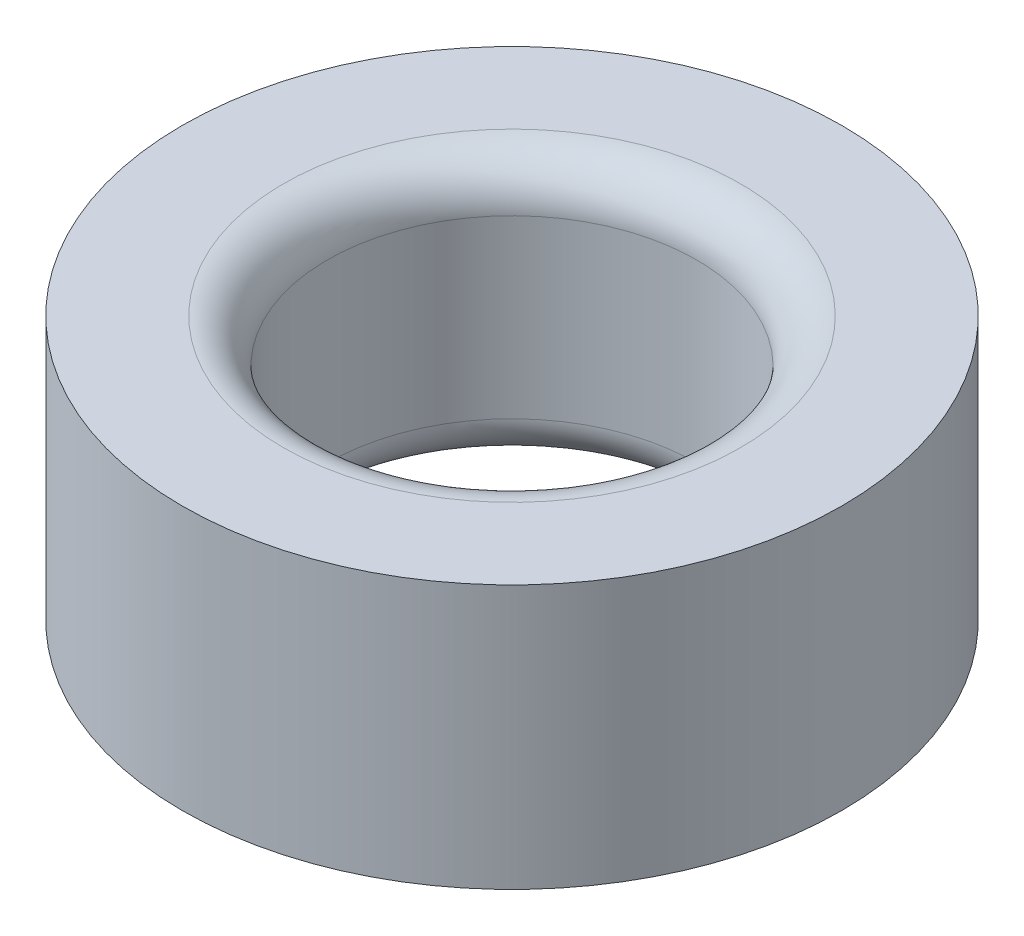
ISO-10303-21;
HEADER;
FILE_DESCRIPTION(('STEP AP214'),'2;1');
FILE_NAME('part.step','',(''),(''),'','','');
FILE_SCHEMA(('AUTOMOTIVE_DESIGN { 1 0 10303 214 1 1 1 1 }'));
ENDSEC;
DATA;
#1=APPLICATION_CONTEXT('core data for automotive mechanical design processes');
#2=APPLICATION_PROTOCOL_DEFINITION('international standard','automotive_design',2000,#1);
#3=PRODUCT_CONTEXT('',#1,'mechanical');
#4=PRODUCT('Part','Part','',(#3));
#5=PRODUCT_RELATED_PRODUCT_CATEGORY('part','',(#4));
#6=PRODUCT_DEFINITION_FORMATION('','',#4);
#7=PRODUCT_DEFINITION_CONTEXT('part definition',#1,'design');
#8=PRODUCT_DEFINITION('design','',#6,#7);
#9=PRODUCT_DEFINITION_SHAPE('','',#8);
#10=(LENGTH_UNIT() NAMED_UNIT(*) SI_UNIT(.MILLI.,.METRE.));
#11=(NAMED_UNIT(*) PLANE_ANGLE_UNIT() SI_UNIT($,.RADIAN.));
#12=(NAMED_UNIT(*) SI_UNIT($,.STERADIAN.) SOLID_ANGLE_UNIT());
#13=UNCERTAINTY_MEASURE_WITH_UNIT(LENGTH_MEASURE(1.E-05),#10,'distance_accuracy_value','');
#14=(GEOMETRIC_REPRESENTATION_CONTEXT(3) GLOBAL_UNCERTAINTY_ASSIGNED_CONTEXT((#13)) GLOBAL_UNIT_ASSIGNED_CONTEXT((#10,
#11,#12)) REPRESENTATION_CONTEXT('',''));
#15=CARTESIAN_POINT('',(0.,0.,0.));
#16=DIRECTION('',(0.,0.,1.));
#17=DIRECTION('',(1.,0.,0.));
#18=AXIS2_PLACEMENT_3D('',#15,#16,#17);
#19=CARTESIAN_POINT('',(0.,3.,0.));
#20=DIRECTION('',(0.,1.,0.));
#21=DIRECTION('',(0.,0.,1.));
#22=AXIS2_PLACEMENT_3D('',#19,#20,#21);
#23=PLANE('',#22);
#24=CARTESIAN_POINT('',(0.,3.,0.));
#25=DIRECTION('',(0.,1.,0.));
#26=DIRECTION('',(0.,0.,1.));
#27=AXIS2_PLACEMENT_3D('',#24,#25,#26);
#28=CIRCLE('',#27,2.6);
#29=CARTESIAN_POINT('',(0.,3.,2.6));
#30=VERTEX_POINT('',#29);
#31=EDGE_CURVE('E10',#30,#30,#28,.F.);
#32=ORIENTED_EDGE('',*,*,#31,.T.);
#33=EDGE_LOOP('',(#32));
#34=FACE_BOUND('',#33,.T.);
#35=CARTESIAN_POINT('',(0.,3.,0.));
#36=DIRECTION('',(0.,1.,0.));
#37=DIRECTION('',(0.,0.,1.));
#38=AXIS2_PLACEMENT_3D('',#35,#36,#37);
#39=CIRCLE('',#38,3.75);
#40=CARTESIAN_POINT('',(0.,3.,3.75));
#41=VERTEX_POINT('',#40);
#42=EDGE_CURVE('E53',#41,#41,#39,.T.);
#43=ORIENTED_EDGE('',*,*,#42,.T.);
#44=EDGE_LOOP('',(#43));
#45=FACE_BOUND('',#44,.T.);
#46=ADVANCED_FACE('F33',(#34,#45),#23,.T.);
#47=CARTESIAN_POINT('',(0.,0.,0.));
#48=DIRECTION('',(0.,1.,0.));
#49=DIRECTION('',(0.,0.,1.));
#50=AXIS2_PLACEMENT_3D('',#47,#48,#49);
#51=PLANE('',#50);
#52=CARTESIAN_POINT('',(0.,0.,0.));
#53=DIRECTION('',(0.,1.,0.));
#54=DIRECTION('',(0.,0.,1.));
#55=AXIS2_PLACEMENT_3D('',#52,#53,#54);
#56=CIRCLE('',#55,2.6);
#57=CARTESIAN_POINT('',(0.,0.,2.6));
#58=VERTEX_POINT('',#57);
#59=EDGE_CURVE('E48',#58,#58,#56,.T.);
#60=ORIENTED_EDGE('',*,*,#59,.T.);
#61=EDGE_LOOP('',(#60));
#62=FACE_BOUND('',#61,.T.);
#63=CARTESIAN_POINT('',(0.,0.,0.));
#64=DIRECTION('',(0.,1.,0.));
#65=DIRECTION('',(0.,0.,1.));
#66=AXIS2_PLACEMENT_3D('',#63,#64,#65);
#67=CIRCLE('',#66,3.75);
#68=CARTESIAN_POINT('',(0.,0.,3.75));
#69=VERTEX_POINT('',#68);
#70=EDGE_CURVE('E54',#69,#69,#67,.T.);
#71=ORIENTED_EDGE('',*,*,#70,.F.);
#72=EDGE_LOOP('',(#71));
#73=FACE_BOUND('',#72,.T.);
#74=ADVANCED_FACE('F65',(#62,#73),#51,.F.);
#75=CARTESIAN_POINT('',(0.,3.,0.));
#76=DIRECTION('',(0.,-1.,0.));
#77=DIRECTION('',(0.,0.,-1.));
#78=AXIS2_PLACEMENT_3D('',#75,#76,#77);
#79=CYLINDRICAL_SURFACE('',#78,3.75);
#80=ORIENTED_EDGE('',*,*,#42,.F.);
#81=EDGE_LOOP('',(#80));
#82=FACE_BOUND('',#81,.T.);
#83=ORIENTED_EDGE('',*,*,#70,.T.);
#84=EDGE_LOOP('',(#83));
#85=FACE_BOUND('',#84,.T.);
#86=ADVANCED_FACE('F61',(#82,#85),#79,.T.);
#87=CARTESIAN_POINT('',(0.,3.,0.));
#88=DIRECTION('',(0.,-1.,0.));
#89=DIRECTION('',(0.,0.,-1.));
#90=AXIS2_PLACEMENT_3D('',#87,#88,#89);
#91=CYLINDRICAL_SURFACE('',#90,2.1);
#92=CARTESIAN_POINT('',(0.,0.5,0.));
#93=DIRECTION('',(0.,1.,0.));
#94=DIRECTION('',(0.,0.,1.));
#95=AXIS2_PLACEMENT_3D('',#92,#93,#94);
#96=CIRCLE('',#95,2.1);
#97=CARTESIAN_POINT('',(0.,0.5,2.1));
#98=VERTEX_POINT('',#97);
#99=EDGE_CURVE('E40',#98,#98,#96,.F.);
#100=ORIENTED_EDGE('',*,*,#99,.T.);
#101=EDGE_LOOP('',(#100));
#102=FACE_BOUND('',#101,.T.);
#103=CARTESIAN_POINT('',(0.,2.5,0.));
#104=DIRECTION('',(0.,1.,0.));
#105=DIRECTION('',(0.,0.,1.));
#106=AXIS2_PLACEMENT_3D('',#103,#104,#105);
#107=CIRCLE('',#106,2.1);
#108=CARTESIAN_POINT('',(0.,2.5,2.1));
#109=VERTEX_POINT('',#108);
#110=EDGE_CURVE('E44',#109,#109,#107,.T.);
#111=ORIENTED_EDGE('',*,*,#110,.T.);
#112=EDGE_LOOP('',(#111));
#113=FACE_BOUND('',#112,.T.);
#114=ADVANCED_FACE('F64',(#102,#113),#91,.F.);
#115=CARTESIAN_POINT('',(0.,0.5,0.));
#116=DIRECTION('',(0.,1.,0.));
#117=DIRECTION('',(0.,0.,1.));
#118=AXIS2_PLACEMENT_3D('',#115,#116,#117);
#119=TOROIDAL_SURFACE('',#118,2.6,0.5);
#120=ORIENTED_EDGE('',*,*,#99,.F.);
#121=EDGE_LOOP('',(#120));
#122=FACE_BOUND('',#121,.T.);
#123=ORIENTED_EDGE('',*,*,#59,.F.);
#124=EDGE_LOOP('',(#123));
#125=FACE_BOUND('',#124,.T.);
#126=ADVANCED_FACE('F77',(#122,#125),#119,.T.);
#127=CARTESIAN_POINT('',(0.,2.5,0.));
#128=DIRECTION('',(0.,1.,0.));
#129=DIRECTION('',(0.,0.,1.));
#130=AXIS2_PLACEMENT_3D('',#127,#128,#129);
#131=TOROIDAL_SURFACE('',#130,2.6,0.5);
#132=ORIENTED_EDGE('',*,*,#31,.F.);
#133=EDGE_LOOP('',(#132));
#134=FACE_BOUND('',#133,.T.);
#135=ORIENTED_EDGE('',*,*,#110,.F.);
#136=EDGE_LOOP('',(#135));
#137=FACE_BOUND('',#136,.T.);
#138=ADVANCED_FACE('F35',(#134,#137),#131,.T.);
#139=CLOSED_SHELL('',(#46,#74,#86,#114,#126,#138));
#140=MANIFOLD_SOLID_BREP('B2',#139);
#141=ADVANCED_BREP_SHAPE_REPRESENTATION('',(#18,#140),#14);
#142=SHAPE_DEFINITION_REPRESENTATION(#9,#141);
ENDSEC;
END-ISO-10303-21;
